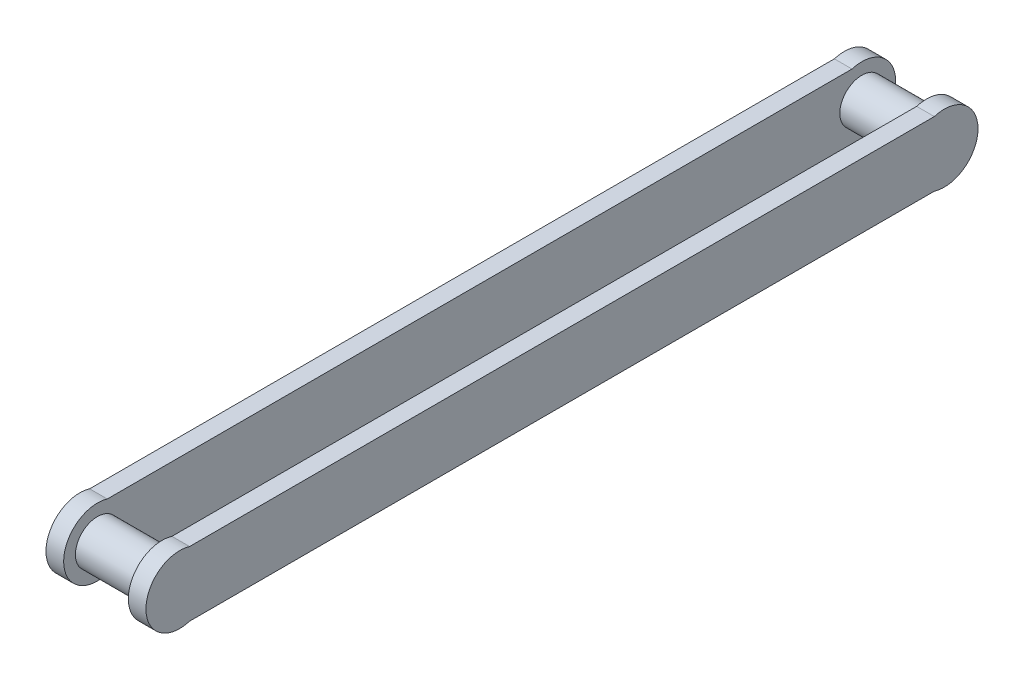
ISO-10303-21;
HEADER;
FILE_DESCRIPTION(('STEP AP214'),'2;1');
FILE_NAME('part.step','',(''),(''),'','','');
FILE_SCHEMA(('AUTOMOTIVE_DESIGN { 1 0 10303 214 1 1 1 1 }'));
ENDSEC;
DATA;
#1=APPLICATION_CONTEXT('core data for automotive mechanical design processes');
#2=APPLICATION_PROTOCOL_DEFINITION('international standard','automotive_design',2000,#1);
#3=PRODUCT_CONTEXT('',#1,'mechanical');
#4=PRODUCT('Part','Part','',(#3));
#5=PRODUCT_RELATED_PRODUCT_CATEGORY('part','',(#4));
#6=PRODUCT_DEFINITION_FORMATION('','',#4);
#7=PRODUCT_DEFINITION_CONTEXT('part definition',#1,'design');
#8=PRODUCT_DEFINITION('design','',#6,#7);
#9=PRODUCT_DEFINITION_SHAPE('','',#8);
#10=(LENGTH_UNIT() NAMED_UNIT(*) SI_UNIT(.MILLI.,.METRE.));
#11=(NAMED_UNIT(*) PLANE_ANGLE_UNIT() SI_UNIT($,.RADIAN.));
#12=(NAMED_UNIT(*) SI_UNIT($,.STERADIAN.) SOLID_ANGLE_UNIT());
#13=UNCERTAINTY_MEASURE_WITH_UNIT(LENGTH_MEASURE(1.E-05),#10,'distance_accuracy_value','');
#14=(GEOMETRIC_REPRESENTATION_CONTEXT(3) GLOBAL_UNCERTAINTY_ASSIGNED_CONTEXT((#13)) GLOBAL_UNIT_ASSIGNED_CONTEXT((#10,
#11,#12)) REPRESENTATION_CONTEXT('',''));
#15=CARTESIAN_POINT('',(0.,0.,0.));
#16=DIRECTION('',(0.,0.,1.));
#17=DIRECTION('',(1.,0.,0.));
#18=AXIS2_PLACEMENT_3D('',#15,#16,#17);
#19=CARTESIAN_POINT('',(0.,0.,0.));
#20=DIRECTION('',(1.,0.,0.));
#21=DIRECTION('',(0.,0.,-1.));
#22=AXIS2_PLACEMENT_3D('',#19,#20,#21);
#23=PLANE('',#22);
#24=CARTESIAN_POINT('',(0.,-2.22284168148864,-40.828044930142));
#25=DIRECTION('',(1.,0.,0.));
#26=DIRECTION('',(0.,0.,-1.));
#27=AXIS2_PLACEMENT_3D('',#24,#25,#26);
#28=CIRCLE('',#27,3.75000000000001);
#29=CARTESIAN_POINT('',(0.,-2.22284168148864,-44.578044930142));
#30=VERTEX_POINT('',#29);
#31=EDGE_CURVE('E11',#30,#30,#28,.T.);
#32=ORIENTED_EDGE('',*,*,#31,.F.);
#33=EDGE_LOOP('',(#32));
#34=FACE_BOUND('',#33,.T.);
#35=DIRECTION('',(0.,0.,-1.));
#36=VECTOR('',#35,1.);
#37=CARTESIAN_POINT('',(0.,3.27715831851136,0.));
#38=LINE('',#37,#36);
#39=CARTESIAN_POINT('',(0.,3.27715831851136,87.4949040867337));
#40=VERTEX_POINT('',#39);
#41=CARTESIAN_POINT('',(0.,3.27715831851136,-39.1509939470171));
#42=VERTEX_POINT('',#41);
#43=EDGE_CURVE('E160',#40,#42,#38,.T.);
#44=ORIENTED_EDGE('',*,*,#43,.F.);
#45=CARTESIAN_POINT('',(0.,-2.22284168148864,89.1719550698585));
#46=DIRECTION('',(1.,0.,0.));
#47=DIRECTION('',(0.,0.,-1.));
#48=AXIS2_PLACEMENT_3D('',#45,#46,#47);
#49=CIRCLE('',#48,5.74999999999999);
#50=CARTESIAN_POINT('',(0.,-7.72284168148864,87.4949040867337));
#51=VERTEX_POINT('',#50);
#52=EDGE_CURVE('E170',#40,#51,#49,.T.);
#53=ORIENTED_EDGE('',*,*,#52,.T.);
#54=DIRECTION('',(0.,0.,-1.));
#55=VECTOR('',#54,1.);
#56=CARTESIAN_POINT('',(0.,-7.72284168148864,0.));
#57=LINE('',#56,#55);
#58=CARTESIAN_POINT('',(0.,-7.72284168148864,-39.1509939470171));
#59=VERTEX_POINT('',#58);
#60=EDGE_CURVE('E173',#51,#59,#57,.T.);
#61=ORIENTED_EDGE('',*,*,#60,.T.);
#62=CARTESIAN_POINT('',(0.,-2.22284168148864,-40.828044930142));
#63=DIRECTION('',(1.,0.,0.));
#64=DIRECTION('',(0.,0.,-1.));
#65=AXIS2_PLACEMENT_3D('',#62,#63,#64);
#66=CIRCLE('',#65,5.75);
#67=EDGE_CURVE('E163',#59,#42,#66,.T.);
#68=ORIENTED_EDGE('',*,*,#67,.T.);
#69=EDGE_LOOP('',(#44,#53,#61,#68));
#70=FACE_BOUND('',#69,.T.);
#71=CARTESIAN_POINT('',(0.,-2.22284168148864,89.1719550698585));
#72=DIRECTION('',(1.,0.,0.));
#73=DIRECTION('',(0.,0.,-1.));
#74=AXIS2_PLACEMENT_3D('',#71,#72,#73);
#75=CIRCLE('',#74,3.75000000000001);
#76=CARTESIAN_POINT('',(0.,-2.22284168148864,85.4219550698585));
#77=VERTEX_POINT('',#76);
#78=EDGE_CURVE('E157',#77,#77,#75,.T.);
#79=ORIENTED_EDGE('',*,*,#78,.F.);
#80=EDGE_LOOP('',(#79));
#81=FACE_BOUND('',#80,.T.);
#82=ADVANCED_FACE('F34',(#34,#70,#81),#23,.T.);
#83=CARTESIAN_POINT('',(5.5,-2.22284168148864,-40.828044930142));
#84=DIRECTION('',(-1.,0.,0.));
#85=DIRECTION('',(0.,0.,1.));
#86=AXIS2_PLACEMENT_3D('',#83,#84,#85);
#87=CYLINDRICAL_SURFACE('',#86,3.75000000000001);
#88=ORIENTED_EDGE('',*,*,#31,.T.);
#89=EDGE_LOOP('',(#88));
#90=FACE_BOUND('',#89,.T.);
#91=CARTESIAN_POINT('',(11.,-2.22284168148864,-40.828044930142));
#92=DIRECTION('',(1.,0.,0.));
#93=DIRECTION('',(0.,0.,-1.));
#94=AXIS2_PLACEMENT_3D('',#91,#92,#93);
#95=CIRCLE('',#94,3.75000000000001);
#96=CARTESIAN_POINT('',(11.,-2.22284168148864,-44.578044930142));
#97=VERTEX_POINT('',#96);
#98=EDGE_CURVE('E154',#97,#97,#95,.T.);
#99=ORIENTED_EDGE('',*,*,#98,.F.);
#100=EDGE_LOOP('',(#99));
#101=FACE_BOUND('',#100,.T.);
#102=ADVANCED_FACE('F36',(#90,#101),#87,.T.);
#103=CARTESIAN_POINT('',(-3.,3.27715831851136,0.));
#104=DIRECTION('',(0.,-1.,0.));
#105=DIRECTION('',(0.,0.,-1.));
#106=AXIS2_PLACEMENT_3D('',#103,#104,#105);
#107=PLANE('',#106);
#108=ORIENTED_EDGE('',*,*,#43,.T.);
#109=DIRECTION('',(1.,0.,0.));
#110=VECTOR('',#109,1.);
#111=CARTESIAN_POINT('',(-3.,3.27715831851136,-39.1509939470171));
#112=LINE('',#111,#110);
#113=CARTESIAN_POINT('',(-3.,3.27715831851136,-39.1509939470171));
#114=VERTEX_POINT('',#113);
#115=EDGE_CURVE('E43',#114,#42,#112,.T.);
#116=ORIENTED_EDGE('',*,*,#115,.F.);
#117=DIRECTION('',(0.,0.,-1.));
#118=VECTOR('',#117,1.);
#119=CARTESIAN_POINT('',(-3.,3.27715831851136,0.));
#120=LINE('',#119,#118);
#121=CARTESIAN_POINT('',(-3.,3.27715831851136,87.4949040867337));
#122=VERTEX_POINT('',#121);
#123=EDGE_CURVE('E51',#122,#114,#120,.T.);
#124=ORIENTED_EDGE('',*,*,#123,.F.);
#125=DIRECTION('',(1.,0.,0.));
#126=VECTOR('',#125,1.);
#127=CARTESIAN_POINT('',(-3.,3.27715831851136,87.4949040867337));
#128=LINE('',#127,#126);
#129=EDGE_CURVE('E82',#122,#40,#128,.T.);
#130=ORIENTED_EDGE('',*,*,#129,.T.);
#131=EDGE_LOOP('',(#108,#116,#124,#130));
#132=FACE_BOUND('',#131,.T.);
#133=ADVANCED_FACE('F182',(#132),#107,.F.);
#134=CARTESIAN_POINT('',(-3.,-2.22284168148864,-40.828044930142));
#135=DIRECTION('',(1.,0.,0.));
#136=DIRECTION('',(0.,0.,-1.));
#137=AXIS2_PLACEMENT_3D('',#134,#135,#136);
#138=CYLINDRICAL_SURFACE('',#137,5.75);
#139=ORIENTED_EDGE('',*,*,#67,.F.);
#140=DIRECTION('',(1.,0.,0.));
#141=VECTOR('',#140,1.);
#142=CARTESIAN_POINT('',(-3.,-7.72284168148864,-39.1509939470171));
#143=LINE('',#142,#141);
#144=CARTESIAN_POINT('',(-3.,-7.72284168148864,-39.1509939470171));
#145=VERTEX_POINT('',#144);
#146=EDGE_CURVE('E69',#145,#59,#143,.T.);
#147=ORIENTED_EDGE('',*,*,#146,.F.);
#148=CARTESIAN_POINT('',(-3.,-2.22284168148864,-40.828044930142));
#149=DIRECTION('',(1.,0.,0.));
#150=DIRECTION('',(0.,0.,-1.));
#151=AXIS2_PLACEMENT_3D('',#148,#149,#150);
#152=CIRCLE('',#151,5.75);
#153=EDGE_CURVE('E167',#145,#114,#152,.T.);
#154=ORIENTED_EDGE('',*,*,#153,.T.);
#155=ORIENTED_EDGE('',*,*,#115,.T.);
#156=EDGE_LOOP('',(#139,#147,#154,#155));
#157=FACE_BOUND('',#156,.T.);
#158=ADVANCED_FACE('F188',(#157),#138,.T.);
#159=CARTESIAN_POINT('',(-3.,-7.72284168148864,0.));
#160=DIRECTION('',(0.,-1.,0.));
#161=DIRECTION('',(0.,0.,-1.));
#162=AXIS2_PLACEMENT_3D('',#159,#160,#161);
#163=PLANE('',#162);
#164=ORIENTED_EDGE('',*,*,#60,.F.);
#165=DIRECTION('',(1.,0.,0.));
#166=VECTOR('',#165,1.);
#167=CARTESIAN_POINT('',(-3.,-7.72284168148864,87.4949040867337));
#168=LINE('',#167,#166);
#169=CARTESIAN_POINT('',(-3.,-7.72284168148864,87.4949040867337));
#170=VERTEX_POINT('',#169);
#171=EDGE_CURVE('E179',#170,#51,#168,.T.);
#172=ORIENTED_EDGE('',*,*,#171,.F.);
#173=DIRECTION('',(0.,0.,-1.));
#174=VECTOR('',#173,1.);
#175=CARTESIAN_POINT('',(-3.,-7.72284168148864,0.));
#176=LINE('',#175,#174);
#177=EDGE_CURVE('E165',#170,#145,#176,.T.);
#178=ORIENTED_EDGE('',*,*,#177,.T.);
#179=ORIENTED_EDGE('',*,*,#146,.T.);
#180=EDGE_LOOP('',(#164,#172,#178,#179));
#181=FACE_BOUND('',#180,.T.);
#182=ADVANCED_FACE('F187',(#181),#163,.T.);
#183=CARTESIAN_POINT('',(-3.,-2.22284168148864,89.1719550698585));
#184=DIRECTION('',(1.,0.,0.));
#185=DIRECTION('',(0.,0.,-1.));
#186=AXIS2_PLACEMENT_3D('',#183,#184,#185);
#187=CYLINDRICAL_SURFACE('',#186,5.74999999999999);
#188=ORIENTED_EDGE('',*,*,#52,.F.);
#189=ORIENTED_EDGE('',*,*,#129,.F.);
#190=CARTESIAN_POINT('',(-3.,-2.22284168148864,89.1719550698585));
#191=DIRECTION('',(1.,0.,0.));
#192=DIRECTION('',(0.,0.,-1.));
#193=AXIS2_PLACEMENT_3D('',#190,#191,#192);
#194=CIRCLE('',#193,5.74999999999999);
#195=EDGE_CURVE('E162',#122,#170,#194,.T.);
#196=ORIENTED_EDGE('',*,*,#195,.T.);
#197=ORIENTED_EDGE('',*,*,#171,.T.);
#198=EDGE_LOOP('',(#188,#189,#196,#197));
#199=FACE_BOUND('',#198,.T.);
#200=ADVANCED_FACE('F185',(#199),#187,.T.);
#201=CARTESIAN_POINT('',(-3.,0.,0.));
#202=DIRECTION('',(1.,0.,0.));
#203=DIRECTION('',(0.,0.,-1.));
#204=AXIS2_PLACEMENT_3D('',#201,#202,#203);
#205=PLANE('',#204);
#206=ORIENTED_EDGE('',*,*,#123,.T.);
#207=ORIENTED_EDGE('',*,*,#153,.F.);
#208=ORIENTED_EDGE('',*,*,#177,.F.);
#209=ORIENTED_EDGE('',*,*,#195,.F.);
#210=EDGE_LOOP('',(#206,#207,#208,#209));
#211=FACE_BOUND('',#210,.T.);
#212=ADVANCED_FACE('F189',(#211),#205,.F.);
#213=CARTESIAN_POINT('',(5.5,-2.22284168148864,89.1719550698585));
#214=DIRECTION('',(-1.,0.,0.));
#215=DIRECTION('',(0.,0.,1.));
#216=AXIS2_PLACEMENT_3D('',#213,#214,#215);
#217=CYLINDRICAL_SURFACE('',#216,3.75000000000001);
#218=ORIENTED_EDGE('',*,*,#78,.T.);
#219=EDGE_LOOP('',(#218));
#220=FACE_BOUND('',#219,.T.);
#221=CARTESIAN_POINT('',(11.,-2.22284168148864,89.1719550698585));
#222=DIRECTION('',(1.,0.,0.));
#223=DIRECTION('',(0.,0.,-1.));
#224=AXIS2_PLACEMENT_3D('',#221,#222,#223);
#225=CIRCLE('',#224,3.75000000000001);
#226=CARTESIAN_POINT('',(11.,-2.22284168148864,85.4219550698585));
#227=VERTEX_POINT('',#226);
#228=EDGE_CURVE('E147',#227,#227,#225,.T.);
#229=ORIENTED_EDGE('',*,*,#228,.F.);
#230=EDGE_LOOP('',(#229));
#231=FACE_BOUND('',#230,.T.);
#232=ADVANCED_FACE('F191',(#220,#231),#217,.T.);
#233=CARTESIAN_POINT('',(11.,0.,0.));
#234=DIRECTION('',(-1.,0.,0.));
#235=DIRECTION('',(0.,0.,-1.));
#236=AXIS2_PLACEMENT_3D('',#233,#234,#235);
#237=PLANE('',#236);
#238=ORIENTED_EDGE('',*,*,#228,.T.);
#239=EDGE_LOOP('',(#238));
#240=FACE_BOUND('',#239,.T.);
#241=DIRECTION('',(0.,0.,-1.));
#242=VECTOR('',#241,1.);
#243=CARTESIAN_POINT('',(11.,3.27715831851136,0.));
#244=LINE('',#243,#242);
#245=CARTESIAN_POINT('',(11.,3.27715831851136,87.4949040867337));
#246=VERTEX_POINT('',#245);
#247=CARTESIAN_POINT('',(11.,3.27715831851136,-39.1509939470171));
#248=VERTEX_POINT('',#247);
#249=EDGE_CURVE('E142',#246,#248,#244,.T.);
#250=ORIENTED_EDGE('',*,*,#249,.T.);
#251=CARTESIAN_POINT('',(11.,-2.22284168148864,-40.828044930142));
#252=DIRECTION('',(1.,0.,0.));
#253=DIRECTION('',(0.,0.,-1.));
#254=AXIS2_PLACEMENT_3D('',#251,#252,#253);
#255=CIRCLE('',#254,5.75);
#256=CARTESIAN_POINT('',(11.,-7.72284168148864,-39.1509939470171));
#257=VERTEX_POINT('',#256);
#258=EDGE_CURVE('E125',#257,#248,#255,.T.);
#259=ORIENTED_EDGE('',*,*,#258,.F.);
#260=DIRECTION('',(0.,0.,-1.));
#261=VECTOR('',#260,1.);
#262=CARTESIAN_POINT('',(11.,-7.72284168148864,0.));
#263=LINE('',#262,#261);
#264=CARTESIAN_POINT('',(11.,-7.72284168148864,87.4949040867337));
#265=VERTEX_POINT('',#264);
#266=EDGE_CURVE('E137',#265,#257,#263,.T.);
#267=ORIENTED_EDGE('',*,*,#266,.F.);
#268=CARTESIAN_POINT('',(11.,-2.22284168148864,89.1719550698585));
#269=DIRECTION('',(1.,0.,0.));
#270=DIRECTION('',(0.,0.,-1.));
#271=AXIS2_PLACEMENT_3D('',#268,#269,#270);
#272=CIRCLE('',#271,5.74999999999999);
#273=EDGE_CURVE('E135',#246,#265,#272,.T.);
#274=ORIENTED_EDGE('',*,*,#273,.F.);
#275=EDGE_LOOP('',(#250,#259,#267,#274));
#276=FACE_BOUND('',#275,.T.);
#277=ORIENTED_EDGE('',*,*,#98,.T.);
#278=EDGE_LOOP('',(#277));
#279=FACE_BOUND('',#278,.T.);
#280=ADVANCED_FACE('F197',(#240,#276,#279),#237,.T.);
#281=CARTESIAN_POINT('',(14.,3.27715831851136,0.));
#282=DIRECTION('',(0.,1.,0.));
#283=DIRECTION('',(0.,0.,1.));
#284=AXIS2_PLACEMENT_3D('',#281,#282,#283);
#285=PLANE('',#284);
#286=ORIENTED_EDGE('',*,*,#249,.F.);
#287=DIRECTION('',(-1.,0.,0.));
#288=VECTOR('',#287,1.);
#289=CARTESIAN_POINT('',(14.,3.27715831851136,87.4949040867337));
#290=LINE('',#289,#288);
#291=CARTESIAN_POINT('',(14.,3.27715831851136,87.4949040867337));
#292=VERTEX_POINT('',#291);
#293=EDGE_CURVE('E133',#292,#246,#290,.T.);
#294=ORIENTED_EDGE('',*,*,#293,.F.);
#295=DIRECTION('',(0.,0.,-1.));
#296=VECTOR('',#295,1.);
#297=CARTESIAN_POINT('',(14.,3.27715831851136,0.));
#298=LINE('',#297,#296);
#299=CARTESIAN_POINT('',(14.,3.27715831851136,-39.1509939470171));
#300=VERTEX_POINT('',#299);
#301=EDGE_CURVE('E114',#292,#300,#298,.T.);
#302=ORIENTED_EDGE('',*,*,#301,.T.);
#303=DIRECTION('',(-1.,0.,0.));
#304=VECTOR('',#303,1.);
#305=CARTESIAN_POINT('',(14.,3.27715831851136,-39.1509939470171));
#306=LINE('',#305,#304);
#307=EDGE_CURVE('E122',#300,#248,#306,.T.);
#308=ORIENTED_EDGE('',*,*,#307,.T.);
#309=EDGE_LOOP('',(#286,#294,#302,#308));
#310=FACE_BOUND('',#309,.T.);
#311=ADVANCED_FACE('F132',(#310),#285,.T.);
#312=CARTESIAN_POINT('',(14.,-2.22284168148864,89.1719550698585));
#313=DIRECTION('',(-1.,0.,0.));
#314=DIRECTION('',(0.,0.,1.));
#315=AXIS2_PLACEMENT_3D('',#312,#313,#314);
#316=CYLINDRICAL_SURFACE('',#315,5.74999999999999);
#317=ORIENTED_EDGE('',*,*,#273,.T.);
#318=DIRECTION('',(-1.,0.,0.));
#319=VECTOR('',#318,1.);
#320=CARTESIAN_POINT('',(14.,-7.72284168148864,87.4949040867337));
#321=LINE('',#320,#319);
#322=CARTESIAN_POINT('',(14.,-7.72284168148864,87.4949040867337));
#323=VERTEX_POINT('',#322);
#324=EDGE_CURVE('E148',#323,#265,#321,.T.);
#325=ORIENTED_EDGE('',*,*,#324,.F.);
#326=CARTESIAN_POINT('',(14.,-2.22284168148864,89.1719550698585));
#327=DIRECTION('',(1.,0.,0.));
#328=DIRECTION('',(0.,0.,-1.));
#329=AXIS2_PLACEMENT_3D('',#326,#327,#328);
#330=CIRCLE('',#329,5.74999999999999);
#331=EDGE_CURVE('E130',#292,#323,#330,.T.);
#332=ORIENTED_EDGE('',*,*,#331,.F.);
#333=ORIENTED_EDGE('',*,*,#293,.T.);
#334=EDGE_LOOP('',(#317,#325,#332,#333));
#335=FACE_BOUND('',#334,.T.);
#336=ADVANCED_FACE('F268',(#335),#316,.T.);
#337=CARTESIAN_POINT('',(14.,-7.72284168148864,0.));
#338=DIRECTION('',(0.,1.,0.));
#339=DIRECTION('',(0.,0.,1.));
#340=AXIS2_PLACEMENT_3D('',#337,#338,#339);
#341=PLANE('',#340);
#342=ORIENTED_EDGE('',*,*,#266,.T.);
#343=DIRECTION('',(-1.,0.,0.));
#344=VECTOR('',#343,1.);
#345=CARTESIAN_POINT('',(14.,-7.72284168148864,-39.1509939470171));
#346=LINE('',#345,#344);
#347=CARTESIAN_POINT('',(14.,-7.72284168148864,-39.1509939470171));
#348=VERTEX_POINT('',#347);
#349=EDGE_CURVE('E129',#348,#257,#346,.T.);
#350=ORIENTED_EDGE('',*,*,#349,.F.);
#351=DIRECTION('',(0.,0.,-1.));
#352=VECTOR('',#351,1.);
#353=CARTESIAN_POINT('',(14.,-7.72284168148864,0.));
#354=LINE('',#353,#352);
#355=EDGE_CURVE('E116',#323,#348,#354,.T.);
#356=ORIENTED_EDGE('',*,*,#355,.F.);
#357=ORIENTED_EDGE('',*,*,#324,.T.);
#358=EDGE_LOOP('',(#342,#350,#356,#357));
#359=FACE_BOUND('',#358,.T.);
#360=ADVANCED_FACE('F277',(#359),#341,.F.);
#361=CARTESIAN_POINT('',(14.,-2.22284168148864,-40.828044930142));
#362=DIRECTION('',(-1.,0.,0.));
#363=DIRECTION('',(0.,0.,1.));
#364=AXIS2_PLACEMENT_3D('',#361,#362,#363);
#365=CYLINDRICAL_SURFACE('',#364,5.75);
#366=ORIENTED_EDGE('',*,*,#258,.T.);
#367=ORIENTED_EDGE('',*,*,#307,.F.);
#368=CARTESIAN_POINT('',(14.,-2.22284168148864,-40.828044930142));
#369=DIRECTION('',(1.,0.,0.));
#370=DIRECTION('',(0.,0.,-1.));
#371=AXIS2_PLACEMENT_3D('',#368,#369,#370);
#372=CIRCLE('',#371,5.75);
#373=EDGE_CURVE('E110',#348,#300,#372,.T.);
#374=ORIENTED_EDGE('',*,*,#373,.F.);
#375=ORIENTED_EDGE('',*,*,#349,.T.);
#376=EDGE_LOOP('',(#366,#367,#374,#375));
#377=FACE_BOUND('',#376,.T.);
#378=ADVANCED_FACE('F123',(#377),#365,.T.);
#379=CARTESIAN_POINT('',(14.,0.,0.));
#380=DIRECTION('',(-1.,0.,0.));
#381=DIRECTION('',(0.,0.,-1.));
#382=AXIS2_PLACEMENT_3D('',#379,#380,#381);
#383=PLANE('',#382);
#384=ORIENTED_EDGE('',*,*,#301,.F.);
#385=ORIENTED_EDGE('',*,*,#331,.T.);
#386=ORIENTED_EDGE('',*,*,#355,.T.);
#387=ORIENTED_EDGE('',*,*,#373,.T.);
#388=EDGE_LOOP('',(#384,#385,#386,#387));
#389=FACE_BOUND('',#388,.T.);
#390=ADVANCED_FACE('F112',(#389),#383,.F.);
#391=CLOSED_SHELL('',(#82,#102,#133,#158,#182,#200,#212,#232,#280,#311,#336,#360,#378,#390));
#392=MANIFOLD_SOLID_BREP('B2',#391);
#393=ADVANCED_BREP_SHAPE_REPRESENTATION('',(#18,#392),#14);
#394=SHAPE_DEFINITION_REPRESENTATION(#9,#393);
ENDSEC;
END-ISO-10303-21;
